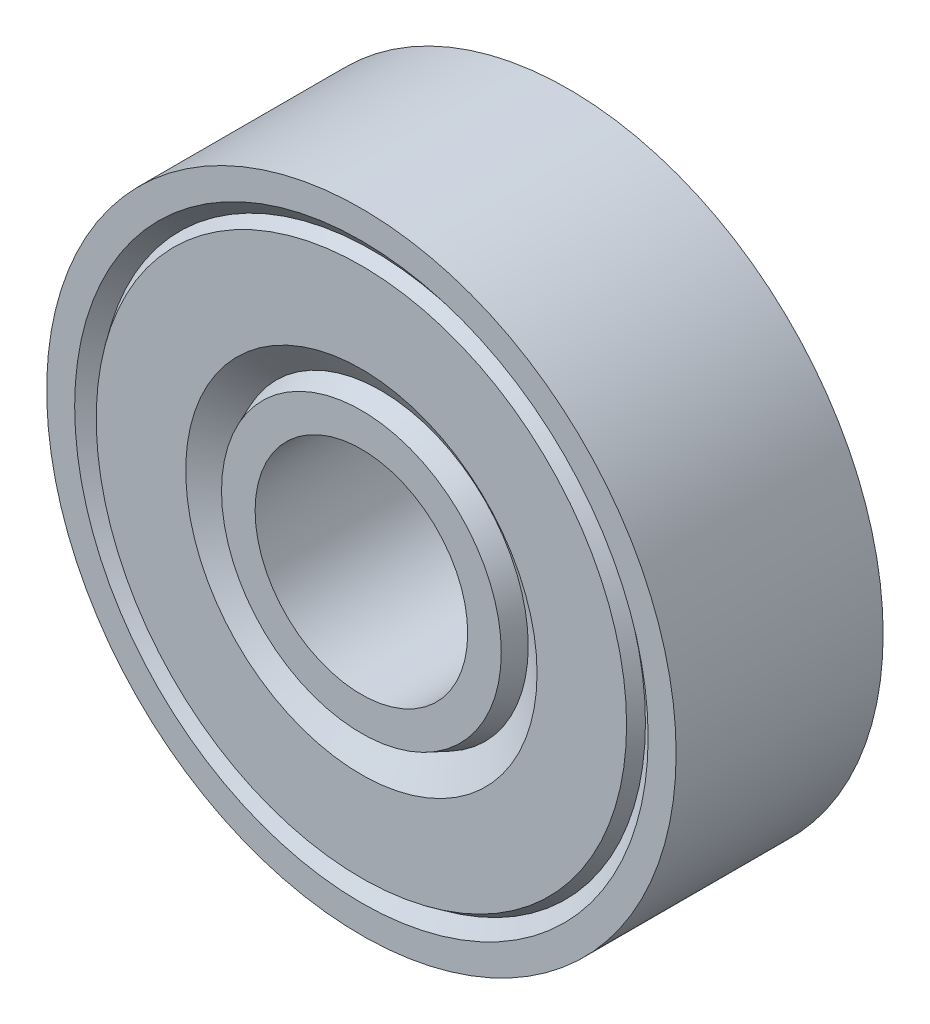
ISO-10303-21;
HEADER;
FILE_DESCRIPTION(('STEP AP214'),'2;1');
FILE_NAME('part.step','',(''),(''),'','','');
FILE_SCHEMA(('AUTOMOTIVE_DESIGN { 1 0 10303 214 1 1 1 1 }'));
ENDSEC;
DATA;
#1=APPLICATION_CONTEXT('core data for automotive mechanical design processes');
#2=APPLICATION_PROTOCOL_DEFINITION('international standard','automotive_design',2000,#1);
#3=PRODUCT_CONTEXT('',#1,'mechanical');
#4=PRODUCT('Part','Part','',(#3));
#5=PRODUCT_RELATED_PRODUCT_CATEGORY('part','',(#4));
#6=PRODUCT_DEFINITION_FORMATION('','',#4);
#7=PRODUCT_DEFINITION_CONTEXT('part definition',#1,'design');
#8=PRODUCT_DEFINITION('design','',#6,#7);
#9=PRODUCT_DEFINITION_SHAPE('','',#8);
#10=(LENGTH_UNIT() NAMED_UNIT(*) SI_UNIT(.MILLI.,.METRE.));
#11=(NAMED_UNIT(*) PLANE_ANGLE_UNIT() SI_UNIT($,.RADIAN.));
#12=(NAMED_UNIT(*) SI_UNIT($,.STERADIAN.) SOLID_ANGLE_UNIT());
#13=UNCERTAINTY_MEASURE_WITH_UNIT(LENGTH_MEASURE(1.E-05),#10,'distance_accuracy_value','');
#14=(GEOMETRIC_REPRESENTATION_CONTEXT(3) GLOBAL_UNCERTAINTY_ASSIGNED_CONTEXT((#13)) GLOBAL_UNIT_ASSIGNED_CONTEXT((#10,
#11,#12)) REPRESENTATION_CONTEXT('',''));
#15=CARTESIAN_POINT('',(0.,0.,0.));
#16=DIRECTION('',(0.,0.,1.));
#17=DIRECTION('',(1.,0.,0.));
#18=AXIS2_PLACEMENT_3D('',#15,#16,#17);
#19=CARTESIAN_POINT('',(0.,0.,0.));
#20=DIRECTION('',(0.,0.,1.));
#21=DIRECTION('',(1.,0.,0.));
#22=AXIS2_PLACEMENT_3D('',#19,#20,#21);
#23=CYLINDRICAL_SURFACE('',#22,4.8259999994669);
#24=CARTESIAN_POINT('',(0.,0.,-4.69899999899461));
#25=DIRECTION('',(0.,0.,1.));
#26=DIRECTION('',(1.,0.,0.));
#27=AXIS2_PLACEMENT_3D('',#24,#25,#26);
#28=CIRCLE('',#27,4.8259999994669);
#29=CARTESIAN_POINT('',(4.8259999994669,0.,-4.69899999899461));
#30=VERTEX_POINT('',#29);
#31=EDGE_CURVE('E80',#30,#30,#28,.T.);
#32=ORIENTED_EDGE('',*,*,#31,.F.);
#33=EDGE_LOOP('',(#32));
#34=FACE_BOUND('',#33,.T.);
#35=CARTESIAN_POINT('',(0.,0.,4.69899999899461));
#36=DIRECTION('',(0.,0.,1.));
#37=DIRECTION('',(1.,0.,0.));
#38=AXIS2_PLACEMENT_3D('',#35,#36,#37);
#39=CIRCLE('',#38,4.8259999994669);
#40=CARTESIAN_POINT('',(4.8259999994669,0.,4.69899999899461));
#41=VERTEX_POINT('',#40);
#42=EDGE_CURVE('E10',#41,#41,#39,.T.);
#43=ORIENTED_EDGE('',*,*,#42,.T.);
#44=EDGE_LOOP('',(#43));
#45=FACE_BOUND('',#44,.T.);
#46=ADVANCED_FACE('F28',(#34,#45),#23,.F.);
#47=CARTESIAN_POINT('',(-6.35000000000027,0.,4.69899999899461));
#48=DIRECTION('',(0.,0.,-1.));
#49=DIRECTION('',(-1.,0.,0.));
#50=AXIS2_PLACEMENT_3D('',#47,#48,#49);
#51=PLANE('',#50);
#52=ORIENTED_EDGE('',*,*,#42,.F.);
#53=EDGE_LOOP('',(#52));
#54=FACE_BOUND('',#53,.T.);
#55=CARTESIAN_POINT('',(0.,0.,4.69899999899461));
#56=DIRECTION('',(0.,0.,1.));
#57=DIRECTION('',(1.,0.,0.));
#58=AXIS2_PLACEMENT_3D('',#55,#56,#57);
#59=CIRCLE('',#58,6.35000000000027);
#60=CARTESIAN_POINT('',(6.35000000000027,0.,4.69899999899461));
#61=VERTEX_POINT('',#60);
#62=EDGE_CURVE('E34',#61,#61,#59,.T.);
#63=ORIENTED_EDGE('',*,*,#62,.T.);
#64=EDGE_LOOP('',(#63));
#65=FACE_BOUND('',#64,.T.);
#66=ADVANCED_FACE('F87',(#54,#65),#51,.F.);
#67=CARTESIAN_POINT('',(0.,0.,3.825839896998));
#68=DIRECTION('',(0.,0.,-1.));
#69=DIRECTION('',(-1.,0.,0.));
#70=AXIS2_PLACEMENT_3D('',#67,#68,#69);
#71=CONICAL_SURFACE('',#70,6.70136220522636,0.382576172037094);
#72=ORIENTED_EDGE('',*,*,#62,.F.);
#73=EDGE_LOOP('',(#72));
#74=FACE_BOUND('',#73,.T.);
#75=CARTESIAN_POINT('',(0.,0.,3.825839896998));
#76=DIRECTION('',(0.,0.,1.));
#77=DIRECTION('',(1.,0.,0.));
#78=AXIS2_PLACEMENT_3D('',#75,#76,#77);
#79=CIRCLE('',#78,6.70136220522636);
#80=CARTESIAN_POINT('',(6.70136220522636,0.,3.825839896998));
#81=VERTEX_POINT('',#80);
#82=EDGE_CURVE('E38',#81,#81,#79,.T.);
#83=ORIENTED_EDGE('',*,*,#82,.T.);
#84=EDGE_LOOP('',(#83));
#85=FACE_BOUND('',#84,.T.);
#86=ADVANCED_FACE('F91',(#74,#85),#71,.T.);
#87=CARTESIAN_POINT('',(0.,0.,4.69899999899461));
#88=DIRECTION('',(0.,0.,1.));
#89=DIRECTION('',(1.,0.,0.));
#90=AXIS2_PLACEMENT_3D('',#87,#88,#89);
#91=CONICAL_SURFACE('',#90,7.97467252915544,0.969704932408119);
#92=ORIENTED_EDGE('',*,*,#82,.F.);
#93=EDGE_LOOP('',(#92));
#94=FACE_BOUND('',#93,.T.);
#95=CARTESIAN_POINT('',(0.,0.,4.69899999899461));
#96=DIRECTION('',(0.,0.,1.));
#97=DIRECTION('',(1.,0.,0.));
#98=AXIS2_PLACEMENT_3D('',#95,#96,#97);
#99=CIRCLE('',#98,7.97467252915544);
#100=CARTESIAN_POINT('',(7.97467252915544,0.,4.69899999899461));
#101=VERTEX_POINT('',#100);
#102=EDGE_CURVE('E42',#101,#101,#99,.T.);
#103=ORIENTED_EDGE('',*,*,#102,.T.);
#104=EDGE_LOOP('',(#103));
#105=FACE_BOUND('',#104,.T.);
#106=ADVANCED_FACE('F96',(#94,#105),#91,.F.);
#107=CARTESIAN_POINT('',(-12.0386725291552,0.,4.69899999899461));
#108=DIRECTION('',(0.,0.,-1.));
#109=DIRECTION('',(-1.,0.,0.));
#110=AXIS2_PLACEMENT_3D('',#107,#108,#109);
#111=PLANE('',#110);
#112=ORIENTED_EDGE('',*,*,#102,.F.);
#113=EDGE_LOOP('',(#112));
#114=FACE_BOUND('',#113,.T.);
#115=CARTESIAN_POINT('',(0.,0.,4.69899999899461));
#116=DIRECTION('',(0.,0.,1.));
#117=DIRECTION('',(1.,0.,0.));
#118=AXIS2_PLACEMENT_3D('',#115,#116,#117);
#119=CIRCLE('',#118,12.0386725291552);
#120=CARTESIAN_POINT('',(12.0386725291552,0.,4.69899999899461));
#121=VERTEX_POINT('',#120);
#122=EDGE_CURVE('E47',#121,#121,#119,.T.);
#123=ORIENTED_EDGE('',*,*,#122,.T.);
#124=EDGE_LOOP('',(#123));
#125=FACE_BOUND('',#124,.T.);
#126=ADVANCED_FACE('F102',(#114,#125),#111,.F.);
#127=CARTESIAN_POINT('',(0.,0.,4.19099999899462));
#128=DIRECTION('',(0.,0.,-1.));
#129=DIRECTION('',(-1.,0.,0.));
#130=AXIS2_PLACEMENT_3D('',#127,#128,#129);
#131=CONICAL_SURFACE('',#130,12.3870285610498,0.601091394386887);
#132=ORIENTED_EDGE('',*,*,#122,.F.);
#133=EDGE_LOOP('',(#132));
#134=FACE_BOUND('',#133,.T.);
#135=CARTESIAN_POINT('',(0.,0.,4.19099999899462));
#136=DIRECTION('',(0.,0.,1.));
#137=DIRECTION('',(1.,0.,0.));
#138=AXIS2_PLACEMENT_3D('',#135,#136,#137);
#139=CIRCLE('',#138,12.3870285610498);
#140=CARTESIAN_POINT('',(12.3870285610498,0.,4.19099999899462));
#141=VERTEX_POINT('',#140);
#142=EDGE_CURVE('E50',#141,#141,#139,.T.);
#143=ORIENTED_EDGE('',*,*,#142,.T.);
#144=EDGE_LOOP('',(#143));
#145=FACE_BOUND('',#144,.T.);
#146=ADVANCED_FACE('F106',(#134,#145),#131,.T.);
#147=CARTESIAN_POINT('',(0.,0.,4.69899999899461));
#148=DIRECTION('',(0.,0.,1.));
#149=DIRECTION('',(1.,0.,0.));
#150=AXIS2_PLACEMENT_3D('',#147,#148,#149);
#151=CONICAL_SURFACE('',#150,13.0174999999999,0.892561379469898);
#152=ORIENTED_EDGE('',*,*,#142,.F.);
#153=EDGE_LOOP('',(#152));
#154=FACE_BOUND('',#153,.T.);
#155=CARTESIAN_POINT('',(0.,0.,4.69899999899461));
#156=DIRECTION('',(0.,0.,1.));
#157=DIRECTION('',(1.,0.,0.));
#158=AXIS2_PLACEMENT_3D('',#155,#156,#157);
#159=CIRCLE('',#158,13.0174999999999);
#160=CARTESIAN_POINT('',(13.0174999999999,0.,4.69899999899461));
#161=VERTEX_POINT('',#160);
#162=EDGE_CURVE('E53',#161,#161,#159,.T.);
#163=ORIENTED_EDGE('',*,*,#162,.T.);
#164=EDGE_LOOP('',(#163));
#165=FACE_BOUND('',#164,.T.);
#166=ADVANCED_FACE('F110',(#154,#165),#151,.F.);
#167=CARTESIAN_POINT('',(-14.2875,0.,4.69899999899461));
#168=DIRECTION('',(0.,0.,-1.));
#169=DIRECTION('',(-1.,0.,0.));
#170=AXIS2_PLACEMENT_3D('',#167,#168,#169);
#171=PLANE('',#170);
#172=ORIENTED_EDGE('',*,*,#162,.F.);
#173=EDGE_LOOP('',(#172));
#174=FACE_BOUND('',#173,.T.);
#175=CARTESIAN_POINT('',(0.,0.,4.69899999899461));
#176=DIRECTION('',(0.,0.,1.));
#177=DIRECTION('',(1.,0.,0.));
#178=AXIS2_PLACEMENT_3D('',#175,#176,#177);
#179=CIRCLE('',#178,14.2875);
#180=CARTESIAN_POINT('',(14.2875,0.,4.69899999899461));
#181=VERTEX_POINT('',#180);
#182=EDGE_CURVE('E56',#181,#181,#179,.T.);
#183=ORIENTED_EDGE('',*,*,#182,.T.);
#184=EDGE_LOOP('',(#183));
#185=FACE_BOUND('',#184,.T.);
#186=ADVANCED_FACE('F114',(#174,#185),#171,.F.);
#187=CARTESIAN_POINT('',(0.,0.,0.));
#188=DIRECTION('',(0.,0.,1.));
#189=DIRECTION('',(1.,0.,0.));
#190=AXIS2_PLACEMENT_3D('',#187,#188,#189);
#191=CYLINDRICAL_SURFACE('',#190,14.2875);
#192=ORIENTED_EDGE('',*,*,#182,.F.);
#193=EDGE_LOOP('',(#192));
#194=FACE_BOUND('',#193,.T.);
#195=CARTESIAN_POINT('',(0.,0.,-4.69899999899461));
#196=DIRECTION('',(0.,0.,1.));
#197=DIRECTION('',(1.,0.,0.));
#198=AXIS2_PLACEMENT_3D('',#195,#196,#197);
#199=CIRCLE('',#198,14.2875);
#200=CARTESIAN_POINT('',(14.2875,0.,-4.69899999899461));
#201=VERTEX_POINT('',#200);
#202=EDGE_CURVE('E59',#201,#201,#199,.T.);
#203=ORIENTED_EDGE('',*,*,#202,.T.);
#204=EDGE_LOOP('',(#203));
#205=FACE_BOUND('',#204,.T.);
#206=ADVANCED_FACE('F118',(#194,#205),#191,.T.);
#207=CARTESIAN_POINT('',(-14.2875,0.,-4.69899999899461));
#208=DIRECTION('',(0.,0.,1.));
#209=DIRECTION('',(1.,0.,0.));
#210=AXIS2_PLACEMENT_3D('',#207,#208,#209);
#211=PLANE('',#210);
#212=ORIENTED_EDGE('',*,*,#202,.F.);
#213=EDGE_LOOP('',(#212));
#214=FACE_BOUND('',#213,.T.);
#215=CARTESIAN_POINT('',(0.,0.,-4.69899999899461));
#216=DIRECTION('',(0.,0.,1.));
#217=DIRECTION('',(1.,0.,0.));
#218=AXIS2_PLACEMENT_3D('',#215,#216,#217);
#219=CIRCLE('',#218,13.0174999999999);
#220=CARTESIAN_POINT('',(13.0174999999999,0.,-4.69899999899461));
#221=VERTEX_POINT('',#220);
#222=EDGE_CURVE('E62',#221,#221,#219,.T.);
#223=ORIENTED_EDGE('',*,*,#222,.T.);
#224=EDGE_LOOP('',(#223));
#225=FACE_BOUND('',#224,.T.);
#226=ADVANCED_FACE('F122',(#214,#225),#211,.F.);
#227=CARTESIAN_POINT('',(0.,0.,-4.19099999899462));
#228=DIRECTION('',(0.,0.,-1.));
#229=DIRECTION('',(-1.,0.,0.));
#230=AXIS2_PLACEMENT_3D('',#227,#228,#229);
#231=CONICAL_SURFACE('',#230,12.3870285610498,0.892561379469898);
#232=ORIENTED_EDGE('',*,*,#222,.F.);
#233=EDGE_LOOP('',(#232));
#234=FACE_BOUND('',#233,.T.);
#235=CARTESIAN_POINT('',(0.,0.,-4.19099999899462));
#236=DIRECTION('',(0.,0.,1.));
#237=DIRECTION('',(1.,0.,0.));
#238=AXIS2_PLACEMENT_3D('',#235,#236,#237);
#239=CIRCLE('',#238,12.3870285610498);
#240=CARTESIAN_POINT('',(12.3870285610498,0.,-4.19099999899462));
#241=VERTEX_POINT('',#240);
#242=EDGE_CURVE('E65',#241,#241,#239,.T.);
#243=ORIENTED_EDGE('',*,*,#242,.T.);
#244=EDGE_LOOP('',(#243));
#245=FACE_BOUND('',#244,.T.);
#246=ADVANCED_FACE('F126',(#234,#245),#231,.F.);
#247=CARTESIAN_POINT('',(0.,0.,-4.69899999899461));
#248=DIRECTION('',(0.,0.,1.));
#249=DIRECTION('',(1.,0.,0.));
#250=AXIS2_PLACEMENT_3D('',#247,#248,#249);
#251=CONICAL_SURFACE('',#250,12.0386725291552,0.601091394386884);
#252=ORIENTED_EDGE('',*,*,#242,.F.);
#253=EDGE_LOOP('',(#252));
#254=FACE_BOUND('',#253,.T.);
#255=CARTESIAN_POINT('',(0.,0.,-4.69899999899461));
#256=DIRECTION('',(0.,0.,1.));
#257=DIRECTION('',(1.,0.,0.));
#258=AXIS2_PLACEMENT_3D('',#255,#256,#257);
#259=CIRCLE('',#258,12.0386725291552);
#260=CARTESIAN_POINT('',(12.0386725291552,0.,-4.69899999899461));
#261=VERTEX_POINT('',#260);
#262=EDGE_CURVE('E68',#261,#261,#259,.T.);
#263=ORIENTED_EDGE('',*,*,#262,.T.);
#264=EDGE_LOOP('',(#263));
#265=FACE_BOUND('',#264,.T.);
#266=ADVANCED_FACE('F130',(#254,#265),#251,.T.);
#267=CARTESIAN_POINT('',(-12.0386725291552,0.,-4.69899999899461));
#268=DIRECTION('',(0.,0.,1.));
#269=DIRECTION('',(1.,0.,0.));
#270=AXIS2_PLACEMENT_3D('',#267,#268,#269);
#271=PLANE('',#270);
#272=ORIENTED_EDGE('',*,*,#262,.F.);
#273=EDGE_LOOP('',(#272));
#274=FACE_BOUND('',#273,.T.);
#275=CARTESIAN_POINT('',(0.,0.,-4.69899999899461));
#276=DIRECTION('',(0.,0.,1.));
#277=DIRECTION('',(1.,0.,0.));
#278=AXIS2_PLACEMENT_3D('',#275,#276,#277);
#279=CIRCLE('',#278,7.97467252915544);
#280=CARTESIAN_POINT('',(7.97467252915544,0.,-4.69899999899461));
#281=VERTEX_POINT('',#280);
#282=EDGE_CURVE('E71',#281,#281,#279,.T.);
#283=ORIENTED_EDGE('',*,*,#282,.T.);
#284=EDGE_LOOP('',(#283));
#285=FACE_BOUND('',#284,.T.);
#286=ADVANCED_FACE('F134',(#274,#285),#271,.F.);
#287=CARTESIAN_POINT('',(0.,0.,-3.825839896998));
#288=DIRECTION('',(0.,0.,-1.));
#289=DIRECTION('',(-1.,0.,0.));
#290=AXIS2_PLACEMENT_3D('',#287,#288,#289);
#291=CONICAL_SURFACE('',#290,6.70136220522636,0.969704932408119);
#292=ORIENTED_EDGE('',*,*,#282,.F.);
#293=EDGE_LOOP('',(#292));
#294=FACE_BOUND('',#293,.T.);
#295=CARTESIAN_POINT('',(0.,0.,-3.825839896998));
#296=DIRECTION('',(0.,0.,1.));
#297=DIRECTION('',(1.,0.,0.));
#298=AXIS2_PLACEMENT_3D('',#295,#296,#297);
#299=CIRCLE('',#298,6.70136220522636);
#300=CARTESIAN_POINT('',(6.70136220522636,0.,-3.825839896998));
#301=VERTEX_POINT('',#300);
#302=EDGE_CURVE('E74',#301,#301,#299,.T.);
#303=ORIENTED_EDGE('',*,*,#302,.T.);
#304=EDGE_LOOP('',(#303));
#305=FACE_BOUND('',#304,.T.);
#306=ADVANCED_FACE('F138',(#294,#305),#291,.F.);
#307=CARTESIAN_POINT('',(0.,0.,-4.69899999899461));
#308=DIRECTION('',(0.,0.,1.));
#309=DIRECTION('',(1.,0.,0.));
#310=AXIS2_PLACEMENT_3D('',#307,#308,#309);
#311=CONICAL_SURFACE('',#310,6.35000000000027,0.382576172037094);
#312=ORIENTED_EDGE('',*,*,#302,.F.);
#313=EDGE_LOOP('',(#312));
#314=FACE_BOUND('',#313,.T.);
#315=CARTESIAN_POINT('',(0.,0.,-4.69899999899461));
#316=DIRECTION('',(0.,0.,1.));
#317=DIRECTION('',(1.,0.,0.));
#318=AXIS2_PLACEMENT_3D('',#315,#316,#317);
#319=CIRCLE('',#318,6.35000000000027);
#320=CARTESIAN_POINT('',(6.35000000000027,0.,-4.69899999899461));
#321=VERTEX_POINT('',#320);
#322=EDGE_CURVE('E77',#321,#321,#319,.T.);
#323=ORIENTED_EDGE('',*,*,#322,.T.);
#324=EDGE_LOOP('',(#323));
#325=FACE_BOUND('',#324,.T.);
#326=ADVANCED_FACE('F142',(#314,#325),#311,.T.);
#327=CARTESIAN_POINT('',(-6.35000000000027,0.,-4.69899999899461));
#328=DIRECTION('',(0.,0.,1.));
#329=DIRECTION('',(1.,0.,0.));
#330=AXIS2_PLACEMENT_3D('',#327,#328,#329);
#331=PLANE('',#330);
#332=ORIENTED_EDGE('',*,*,#322,.F.);
#333=EDGE_LOOP('',(#332));
#334=FACE_BOUND('',#333,.T.);
#335=ORIENTED_EDGE('',*,*,#31,.T.);
#336=EDGE_LOOP('',(#335));
#337=FACE_BOUND('',#336,.T.);
#338=ADVANCED_FACE('F84',(#334,#337),#331,.F.);
#339=CLOSED_SHELL('',(#46,#66,#86,#106,#126,#146,#166,#186,#206,#226,#246,#266,#286,#306,#326,#338));
#340=MANIFOLD_SOLID_BREP('B2',#339);
#341=ADVANCED_BREP_SHAPE_REPRESENTATION('',(#18,#340),#14);
#342=SHAPE_DEFINITION_REPRESENTATION(#9,#341);
ENDSEC;
END-ISO-10303-21;
